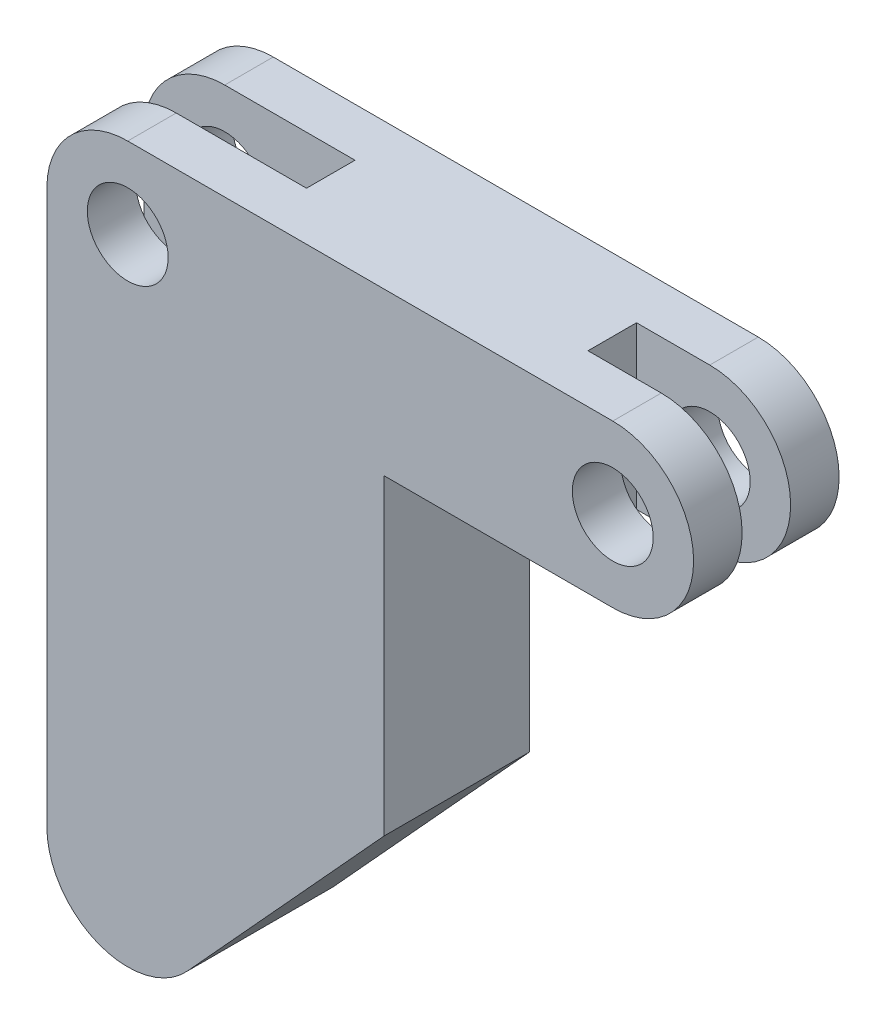
ISO-10303-21;
HEADER;
FILE_DESCRIPTION(('STEP AP214'),'2;1');
FILE_NAME('part.step','',(''),(''),'','','');
FILE_SCHEMA(('AUTOMOTIVE_DESIGN { 1 0 10303 214 1 1 1 1 }'));
ENDSEC;
DATA;
#1=APPLICATION_CONTEXT('core data for automotive mechanical design processes');
#2=APPLICATION_PROTOCOL_DEFINITION('international standard','automotive_design',2000,#1);
#3=PRODUCT_CONTEXT('',#1,'mechanical');
#4=PRODUCT('Part','Part','',(#3));
#5=PRODUCT_RELATED_PRODUCT_CATEGORY('part','',(#4));
#6=PRODUCT_DEFINITION_FORMATION('','',#4);
#7=PRODUCT_DEFINITION_CONTEXT('part definition',#1,'design');
#8=PRODUCT_DEFINITION('design','',#6,#7);
#9=PRODUCT_DEFINITION_SHAPE('','',#8);
#10=(LENGTH_UNIT() NAMED_UNIT(*) SI_UNIT(.MILLI.,.METRE.));
#11=(NAMED_UNIT(*) PLANE_ANGLE_UNIT() SI_UNIT($,.RADIAN.));
#12=(NAMED_UNIT(*) SI_UNIT($,.STERADIAN.) SOLID_ANGLE_UNIT());
#13=UNCERTAINTY_MEASURE_WITH_UNIT(LENGTH_MEASURE(1.E-05),#10,'distance_accuracy_value','');
#14=(GEOMETRIC_REPRESENTATION_CONTEXT(3) GLOBAL_UNCERTAINTY_ASSIGNED_CONTEXT((#13)) GLOBAL_UNIT_ASSIGNED_CONTEXT((#10,
#11,#12)) REPRESENTATION_CONTEXT('',''));
#15=CARTESIAN_POINT('',(0.,0.,0.));
#16=DIRECTION('',(0.,0.,1.));
#17=DIRECTION('',(1.,0.,0.));
#18=AXIS2_PLACEMENT_3D('',#15,#16,#17);
#19=CARTESIAN_POINT('',(15.,0.,4.5));
#20=DIRECTION('',(0.,0.,-1.));
#21=DIRECTION('',(-1.,0.,0.));
#22=AXIS2_PLACEMENT_3D('',#19,#20,#21);
#23=CYLINDRICAL_SURFACE('',#22,5.);
#24=CARTESIAN_POINT('',(15.,0.,1.5));
#25=DIRECTION('',(0.,0.,1.));
#26=DIRECTION('',(-1.,0.,0.));
#27=AXIS2_PLACEMENT_3D('',#24,#25,#26);
#28=CIRCLE('',#27,5.);
#29=CARTESIAN_POINT('',(15.0000000000001,-5.,1.5));
#30=VERTEX_POINT('',#29);
#31=CARTESIAN_POINT('',(15.,5.00000000000001,1.5));
#32=VERTEX_POINT('',#31);
#33=EDGE_CURVE('E178',#30,#32,#28,.T.);
#34=ORIENTED_EDGE('',*,*,#33,.T.);
#35=DIRECTION('',(0.,0.,-1.));
#36=VECTOR('',#35,1.);
#37=CARTESIAN_POINT('',(15.,5.00000000000001,4.5));
#38=LINE('',#37,#36);
#39=CARTESIAN_POINT('',(15.,5.00000000000001,4.5));
#40=VERTEX_POINT('',#39);
#41=EDGE_CURVE('E290',#40,#32,#38,.T.);
#42=ORIENTED_EDGE('',*,*,#41,.F.);
#43=CARTESIAN_POINT('',(15.,0.,4.5));
#44=DIRECTION('',(0.,0.,1.));
#45=DIRECTION('',(1.,0.,0.));
#46=AXIS2_PLACEMENT_3D('',#43,#44,#45);
#47=CIRCLE('',#46,5.);
#48=CARTESIAN_POINT('',(15.,-4.99999999999999,4.5));
#49=VERTEX_POINT('',#48);
#50=EDGE_CURVE('E226',#49,#40,#47,.T.);
#51=ORIENTED_EDGE('',*,*,#50,.F.);
#52=DIRECTION('',(0.,0.,-1.));
#53=VECTOR('',#52,1.);
#54=CARTESIAN_POINT('',(15.,-4.99999999999999,4.5));
#55=LINE('',#54,#53);
#56=EDGE_CURVE('E46',#49,#30,#55,.T.);
#57=ORIENTED_EDGE('',*,*,#56,.T.);
#58=EDGE_LOOP('',(#34,#42,#51,#57));
#59=FACE_BOUND('',#58,.T.);
#60=ADVANCED_FACE('F37',(#59),#23,.T.);
#61=CARTESIAN_POINT('',(15.,0.,4.5));
#62=DIRECTION('',(0.,0.,-1.));
#63=DIRECTION('',(-1.,0.,0.));
#64=AXIS2_PLACEMENT_3D('',#61,#62,#63);
#65=CYLINDRICAL_SURFACE('',#64,2.5);
#66=CARTESIAN_POINT('',(15.,0.,4.5));
#67=DIRECTION('',(0.,0.,1.));
#68=DIRECTION('',(1.,0.,0.));
#69=AXIS2_PLACEMENT_3D('',#66,#67,#68);
#70=CIRCLE('',#69,2.5);
#71=CARTESIAN_POINT('',(17.5,0.,4.5));
#72=VERTEX_POINT('',#71);
#73=EDGE_CURVE('E239',#72,#72,#70,.T.);
#74=ORIENTED_EDGE('',*,*,#73,.T.);
#75=EDGE_LOOP('',(#74));
#76=FACE_BOUND('',#75,.T.);
#77=CARTESIAN_POINT('',(15.,0.,1.5));
#78=DIRECTION('',(0.,0.,-1.));
#79=DIRECTION('',(-1.,0.,0.));
#80=AXIS2_PLACEMENT_3D('',#77,#78,#79);
#81=CIRCLE('',#80,2.5);
#82=CARTESIAN_POINT('',(12.5,0.,1.5));
#83=VERTEX_POINT('',#82);
#84=EDGE_CURVE('E183',#83,#83,#81,.T.);
#85=ORIENTED_EDGE('',*,*,#84,.T.);
#86=EDGE_LOOP('',(#85));
#87=FACE_BOUND('',#86,.T.);
#88=ADVANCED_FACE('F311',(#76,#87),#65,.F.);
#89=CARTESIAN_POINT('',(-15.,0.,4.5));
#90=DIRECTION('',(0.,0.,-1.));
#91=DIRECTION('',(-1.,0.,0.));
#92=AXIS2_PLACEMENT_3D('',#89,#90,#91);
#93=CYLINDRICAL_SURFACE('',#92,5.);
#94=CARTESIAN_POINT('',(-15.,0.,1.5));
#95=DIRECTION('',(0.,0.,1.));
#96=DIRECTION('',(-1.,0.,0.));
#97=AXIS2_PLACEMENT_3D('',#94,#95,#96);
#98=CIRCLE('',#97,5.00000000000005);
#99=CARTESIAN_POINT('',(-15.,5.,1.5));
#100=VERTEX_POINT('',#99);
#101=CARTESIAN_POINT('',(-20.,0.,1.5));
#102=VERTEX_POINT('',#101);
#103=EDGE_CURVE('E191',#100,#102,#98,.T.);
#104=ORIENTED_EDGE('',*,*,#103,.T.);
#105=DIRECTION('',(0.,0.,-1.));
#106=VECTOR('',#105,1.);
#107=CARTESIAN_POINT('',(-20.,0.,4.5));
#108=LINE('',#107,#106);
#109=CARTESIAN_POINT('',(-20.,0.,4.5));
#110=VERTEX_POINT('',#109);
#111=EDGE_CURVE('E282',#110,#102,#108,.T.);
#112=ORIENTED_EDGE('',*,*,#111,.F.);
#113=CARTESIAN_POINT('',(-15.,0.,4.5));
#114=DIRECTION('',(0.,0.,1.));
#115=DIRECTION('',(1.,0.,0.));
#116=AXIS2_PLACEMENT_3D('',#113,#114,#115);
#117=CIRCLE('',#116,5.);
#118=CARTESIAN_POINT('',(-15.,5.,4.5));
#119=VERTEX_POINT('',#118);
#120=EDGE_CURVE('E231',#119,#110,#117,.T.);
#121=ORIENTED_EDGE('',*,*,#120,.F.);
#122=DIRECTION('',(0.,0.,-1.));
#123=VECTOR('',#122,1.);
#124=CARTESIAN_POINT('',(-15.,5.,4.5));
#125=LINE('',#124,#123);
#126=EDGE_CURVE('E286',#119,#100,#125,.T.);
#127=ORIENTED_EDGE('',*,*,#126,.T.);
#128=EDGE_LOOP('',(#104,#112,#121,#127));
#129=FACE_BOUND('',#128,.T.);
#130=ADVANCED_FACE('F367',(#129),#93,.T.);
#131=CARTESIAN_POINT('',(0.,5.,4.5));
#132=DIRECTION('',(0.,1.,0.));
#133=DIRECTION('',(-1.,0.,0.));
#134=AXIS2_PLACEMENT_3D('',#131,#132,#133);
#135=PLANE('',#134);
#136=DIRECTION('',(-1.,0.,0.));
#137=VECTOR('',#136,1.);
#138=CARTESIAN_POINT('',(10.4686995280065,5.,-1.5));
#139=LINE('',#138,#137);
#140=CARTESIAN_POINT('',(15.,5.00000000000001,-1.5));
#141=VERTEX_POINT('',#140);
#142=CARTESIAN_POINT('',(10.4686995280065,5.,-1.5));
#143=VERTEX_POINT('',#142);
#144=EDGE_CURVE('E170',#141,#143,#139,.T.);
#145=ORIENTED_EDGE('',*,*,#144,.F.);
#146=CARTESIAN_POINT('',(15.,5.00000000000001,-4.5));
#147=VERTEX_POINT('',#146);
#148=EDGE_CURVE('E289',#141,#147,#38,.T.);
#149=ORIENTED_EDGE('',*,*,#148,.T.);
#150=DIRECTION('',(1.,0.,0.));
#151=VECTOR('',#150,1.);
#152=CARTESIAN_POINT('',(0.,5.,-4.5));
#153=LINE('',#152,#151);
#154=CARTESIAN_POINT('',(-15.,5.,-4.5));
#155=VERTEX_POINT('',#154);
#156=EDGE_CURVE('E256',#155,#147,#153,.T.);
#157=ORIENTED_EDGE('',*,*,#156,.F.);
#158=CARTESIAN_POINT('',(-15.,5.,-1.5));
#159=VERTEX_POINT('',#158);
#160=EDGE_CURVE('E285',#159,#155,#125,.T.);
#161=ORIENTED_EDGE('',*,*,#160,.F.);
#162=DIRECTION('',(1.,0.,0.));
#163=VECTOR('',#162,1.);
#164=CARTESIAN_POINT('',(0.,5.,-1.5));
#165=LINE('',#164,#163);
#166=CARTESIAN_POINT('',(-6.9423149924925,5.,-1.5));
#167=VERTEX_POINT('',#166);
#168=EDGE_CURVE('E193',#159,#167,#165,.T.);
#169=ORIENTED_EDGE('',*,*,#168,.T.);
#170=DIRECTION('',(0.,0.,1.));
#171=VECTOR('',#170,1.);
#172=CARTESIAN_POINT('',(-6.9423149924925,5.,-1.5));
#173=LINE('',#172,#171);
#174=CARTESIAN_POINT('',(-6.9423149924925,5.,1.5));
#175=VERTEX_POINT('',#174);
#176=EDGE_CURVE('E212',#167,#175,#173,.T.);
#177=ORIENTED_EDGE('',*,*,#176,.T.);
#178=DIRECTION('',(1.,0.,0.));
#179=VECTOR('',#178,1.);
#180=CARTESIAN_POINT('',(0.,5.,1.5));
#181=LINE('',#180,#179);
#182=EDGE_CURVE('E190',#100,#175,#181,.T.);
#183=ORIENTED_EDGE('',*,*,#182,.F.);
#184=ORIENTED_EDGE('',*,*,#126,.F.);
#185=DIRECTION('',(1.,0.,0.));
#186=VECTOR('',#185,1.);
#187=CARTESIAN_POINT('',(0.,5.,4.5));
#188=LINE('',#187,#186);
#189=EDGE_CURVE('E228',#119,#40,#188,.T.);
#190=ORIENTED_EDGE('',*,*,#189,.T.);
#191=ORIENTED_EDGE('',*,*,#41,.T.);
#192=DIRECTION('',(-1.,0.,0.));
#193=VECTOR('',#192,1.);
#194=CARTESIAN_POINT('',(10.4686995280065,5.,1.5));
#195=LINE('',#194,#193);
#196=CARTESIAN_POINT('',(10.4686995280065,5.,1.5));
#197=VERTEX_POINT('',#196);
#198=EDGE_CURVE('E54',#32,#197,#195,.T.);
#199=ORIENTED_EDGE('',*,*,#198,.T.);
#200=DIRECTION('',(0.,0.,1.));
#201=VECTOR('',#200,1.);
#202=CARTESIAN_POINT('',(10.4686995280065,5.,-1.5));
#203=LINE('',#202,#201);
#204=EDGE_CURVE('E164',#143,#197,#203,.T.);
#205=ORIENTED_EDGE('',*,*,#204,.F.);
#206=EDGE_LOOP('',(#145,#149,#157,#161,#169,#177,#183,#184,#190,#191,#199,#205));
#207=FACE_BOUND('',#206,.T.);
#208=ADVANCED_FACE('F180',(#207),#135,.T.);
#209=CARTESIAN_POINT('',(-20.,0.,4.5));
#210=DIRECTION('',(1.,0.,0.));
#211=DIRECTION('',(0.,0.,-1.));
#212=AXIS2_PLACEMENT_3D('',#209,#210,#211);
#213=PLANE('',#212);
#214=DIRECTION('',(0.,1.,0.));
#215=VECTOR('',#214,1.);
#216=CARTESIAN_POINT('',(-20.,0.,-1.5));
#217=LINE('',#216,#215);
#218=CARTESIAN_POINT('',(-20.,-8.26516535468284,-1.5));
#219=VERTEX_POINT('',#218);
#220=CARTESIAN_POINT('',(-20.,0.,-1.5));
#221=VERTEX_POINT('',#220);
#222=EDGE_CURVE('E196',#219,#221,#217,.T.);
#223=ORIENTED_EDGE('',*,*,#222,.T.);
#224=CARTESIAN_POINT('',(-20.,0.,-4.5));
#225=VERTEX_POINT('',#224);
#226=EDGE_CURVE('E281',#221,#225,#108,.T.);
#227=ORIENTED_EDGE('',*,*,#226,.T.);
#228=DIRECTION('',(0.,-1.,0.));
#229=VECTOR('',#228,1.);
#230=CARTESIAN_POINT('',(-20.,0.,-4.5));
#231=LINE('',#230,#229);
#232=CARTESIAN_POINT('',(-20.,-34.242134344058,-4.5));
#233=VERTEX_POINT('',#232);
#234=EDGE_CURVE('E262',#225,#233,#231,.T.);
#235=ORIENTED_EDGE('',*,*,#234,.T.);
#236=DIRECTION('',(0.,0.,-1.));
#237=VECTOR('',#236,1.);
#238=CARTESIAN_POINT('',(-20.,-34.242134344058,4.5));
#239=LINE('',#238,#237);
#240=CARTESIAN_POINT('',(-20.,-34.242134344058,4.5));
#241=VERTEX_POINT('',#240);
#242=EDGE_CURVE('E278',#241,#233,#239,.T.);
#243=ORIENTED_EDGE('',*,*,#242,.F.);
#244=DIRECTION('',(0.,-1.,0.));
#245=VECTOR('',#244,1.);
#246=CARTESIAN_POINT('',(-20.,0.,4.5));
#247=LINE('',#246,#245);
#248=EDGE_CURVE('E233',#110,#241,#247,.T.);
#249=ORIENTED_EDGE('',*,*,#248,.F.);
#250=ORIENTED_EDGE('',*,*,#111,.T.);
#251=DIRECTION('',(0.,1.,0.));
#252=VECTOR('',#251,1.);
#253=CARTESIAN_POINT('',(-20.,0.,1.5));
#254=LINE('',#253,#252);
#255=CARTESIAN_POINT('',(-20.,-8.26516535468284,1.5));
#256=VERTEX_POINT('',#255);
#257=EDGE_CURVE('E206',#256,#102,#254,.T.);
#258=ORIENTED_EDGE('',*,*,#257,.F.);
#259=DIRECTION('',(0.,0.,1.));
#260=VECTOR('',#259,1.);
#261=CARTESIAN_POINT('',(-20.,-8.26516535468284,-1.5));
#262=LINE('',#261,#260);
#263=EDGE_CURVE('E62',#219,#256,#262,.T.);
#264=ORIENTED_EDGE('',*,*,#263,.F.);
#265=EDGE_LOOP('',(#223,#227,#235,#243,#249,#250,#258,#264));
#266=FACE_BOUND('',#265,.T.);
#267=ADVANCED_FACE('F326',(#266),#213,.F.);
#268=CARTESIAN_POINT('',(-15.,0.,4.5));
#269=DIRECTION('',(0.,0.,-1.));
#270=DIRECTION('',(-1.,0.,0.));
#271=AXIS2_PLACEMENT_3D('',#268,#269,#270);
#272=CYLINDRICAL_SURFACE('',#271,2.5);
#273=CARTESIAN_POINT('',(-15.,0.,-4.5));
#274=DIRECTION('',(0.,0.,1.));
#275=DIRECTION('',(1.,0.,0.));
#276=AXIS2_PLACEMENT_3D('',#273,#274,#275);
#277=CIRCLE('',#276,2.5);
#278=CARTESIAN_POINT('',(-12.5,0.,-4.5));
#279=VERTEX_POINT('',#278);
#280=EDGE_CURVE('E224',#279,#279,#277,.T.);
#281=ORIENTED_EDGE('',*,*,#280,.F.);
#282=EDGE_LOOP('',(#281));
#283=FACE_BOUND('',#282,.T.);
#284=CARTESIAN_POINT('',(-15.,0.,-1.5));
#285=DIRECTION('',(0.,0.,1.));
#286=DIRECTION('',(1.,0.,0.));
#287=AXIS2_PLACEMENT_3D('',#284,#285,#286);
#288=CIRCLE('',#287,2.5);
#289=CARTESIAN_POINT('',(-12.5,0.,-1.5));
#290=VERTEX_POINT('',#289);
#291=EDGE_CURVE('E250',#290,#290,#288,.T.);
#292=ORIENTED_EDGE('',*,*,#291,.T.);
#293=EDGE_LOOP('',(#292));
#294=FACE_BOUND('',#293,.T.);
#295=ADVANCED_FACE('F323',(#283,#294),#272,.F.);
#296=CARTESIAN_POINT('',(0.854324149664104,0.,4.5));
#297=DIRECTION('',(-1.,0.,0.));
#298=DIRECTION('',(0.,0.,1.));
#299=AXIS2_PLACEMENT_3D('',#296,#297,#298);
#300=PLANE('',#299);
#301=DIRECTION('',(0.,1.,0.));
#302=VECTOR('',#301,1.);
#303=CARTESIAN_POINT('',(0.854324149664104,0.,-4.5));
#304=LINE('',#303,#302);
#305=CARTESIAN_POINT('',(0.854324149664101,-24.2980374406502,-4.5));
#306=VERTEX_POINT('',#305);
#307=CARTESIAN_POINT('',(0.854324149664104,-5.,-4.5));
#308=VERTEX_POINT('',#307);
#309=EDGE_CURVE('E246',#306,#308,#304,.T.);
#310=ORIENTED_EDGE('',*,*,#309,.T.);
#311=DIRECTION('',(0.,0.,-1.));
#312=VECTOR('',#311,1.);
#313=CARTESIAN_POINT('',(0.854324149664104,-5.,4.5));
#314=LINE('',#313,#312);
#315=CARTESIAN_POINT('',(0.854324149664104,-5.,4.5));
#316=VERTEX_POINT('',#315);
#317=EDGE_CURVE('E11',#316,#308,#314,.T.);
#318=ORIENTED_EDGE('',*,*,#317,.F.);
#319=DIRECTION('',(0.,1.,0.));
#320=VECTOR('',#319,1.);
#321=CARTESIAN_POINT('',(0.854324149664104,0.,4.5));
#322=LINE('',#321,#320);
#323=CARTESIAN_POINT('',(0.854324149664101,-24.2980374406502,4.5));
#324=VERTEX_POINT('',#323);
#325=EDGE_CURVE('E220',#324,#316,#322,.T.);
#326=ORIENTED_EDGE('',*,*,#325,.F.);
#327=DIRECTION('',(0.,0.,-1.));
#328=VECTOR('',#327,1.);
#329=CARTESIAN_POINT('',(0.854324149664101,-24.2980374406502,4.5));
#330=LINE('',#329,#328);
#331=EDGE_CURVE('E245',#324,#306,#330,.T.);
#332=ORIENTED_EDGE('',*,*,#331,.T.);
#333=EDGE_LOOP('',(#310,#318,#326,#332));
#334=FACE_BOUND('',#333,.T.);
#335=ADVANCED_FACE('F39',(#334),#300,.F.);
#336=CARTESIAN_POINT('',(0.,-5.,4.5));
#337=DIRECTION('',(0.,1.,0.));
#338=DIRECTION('',(-1.,0.,0.));
#339=AXIS2_PLACEMENT_3D('',#336,#337,#338);
#340=PLANE('',#339);
#341=CARTESIAN_POINT('',(15.0000000000001,-5.,-1.5));
#342=VERTEX_POINT('',#341);
#343=CARTESIAN_POINT('',(15.,-4.99999999999999,-4.5));
#344=VERTEX_POINT('',#343);
#345=EDGE_CURVE('E292',#342,#344,#55,.T.);
#346=ORIENTED_EDGE('',*,*,#345,.F.);
#347=DIRECTION('',(1.,0.,0.));
#348=VECTOR('',#347,1.);
#349=CARTESIAN_POINT('',(10.4686995280065,-5.,-1.5));
#350=LINE('',#349,#348);
#351=CARTESIAN_POINT('',(10.4686995280065,-5.,-1.5));
#352=VERTEX_POINT('',#351);
#353=EDGE_CURVE('E169',#352,#342,#350,.T.);
#354=ORIENTED_EDGE('',*,*,#353,.F.);
#355=DIRECTION('',(0.,0.,1.));
#356=VECTOR('',#355,1.);
#357=CARTESIAN_POINT('',(10.4686995280065,-5.,-1.5));
#358=LINE('',#357,#356);
#359=CARTESIAN_POINT('',(10.4686995280065,-5.,1.5));
#360=VERTEX_POINT('',#359);
#361=EDGE_CURVE('E166',#352,#360,#358,.T.);
#362=ORIENTED_EDGE('',*,*,#361,.T.);
#363=DIRECTION('',(1.,0.,0.));
#364=VECTOR('',#363,1.);
#365=CARTESIAN_POINT('',(10.4686995280065,-5.,1.5));
#366=LINE('',#365,#364);
#367=EDGE_CURVE('E377',#360,#30,#366,.T.);
#368=ORIENTED_EDGE('',*,*,#367,.T.);
#369=ORIENTED_EDGE('',*,*,#56,.F.);
#370=DIRECTION('',(1.,0.,0.));
#371=VECTOR('',#370,1.);
#372=CARTESIAN_POINT('',(0.,-5.,4.5));
#373=LINE('',#372,#371);
#374=EDGE_CURVE('E223',#316,#49,#373,.T.);
#375=ORIENTED_EDGE('',*,*,#374,.F.);
#376=ORIENTED_EDGE('',*,*,#317,.T.);
#377=DIRECTION('',(1.,0.,0.));
#378=VECTOR('',#377,1.);
#379=CARTESIAN_POINT('',(0.,-5.,-4.5));
#380=LINE('',#379,#378);
#381=EDGE_CURVE('E249',#308,#344,#380,.T.);
#382=ORIENTED_EDGE('',*,*,#381,.T.);
#383=EDGE_LOOP('',(#346,#354,#362,#368,#369,#375,#376,#382));
#384=FACE_BOUND('',#383,.T.);
#385=ADVANCED_FACE('F387',(#384),#340,.F.);
#386=ORIENTED_EDGE('',*,*,#148,.F.);
#387=CARTESIAN_POINT('',(15.,0.,-1.5));
#388=DIRECTION('',(0.,0.,1.));
#389=DIRECTION('',(-1.,0.,0.));
#390=AXIS2_PLACEMENT_3D('',#387,#388,#389);
#391=CIRCLE('',#390,5.);
#392=EDGE_CURVE('E175',#342,#141,#391,.T.);
#393=ORIENTED_EDGE('',*,*,#392,.F.);
#394=ORIENTED_EDGE('',*,*,#345,.T.);
#395=CARTESIAN_POINT('',(15.,0.,-4.5));
#396=DIRECTION('',(0.,0.,1.));
#397=DIRECTION('',(1.,0.,0.));
#398=AXIS2_PLACEMENT_3D('',#395,#396,#397);
#399=CIRCLE('',#398,5.);
#400=EDGE_CURVE('E253',#344,#147,#399,.T.);
#401=ORIENTED_EDGE('',*,*,#400,.T.);
#402=EDGE_LOOP('',(#386,#393,#394,#401));
#403=FACE_BOUND('',#402,.T.);
#404=ADVANCED_FACE('F386',(#403),#23,.T.);
#405=ORIENTED_EDGE('',*,*,#226,.F.);
#406=CARTESIAN_POINT('',(-15.,0.,-1.5));
#407=DIRECTION('',(0.,0.,1.));
#408=DIRECTION('',(-1.,0.,0.));
#409=AXIS2_PLACEMENT_3D('',#406,#407,#408);
#410=CIRCLE('',#409,5.00000000000005);
#411=EDGE_CURVE('E188',#159,#221,#410,.T.);
#412=ORIENTED_EDGE('',*,*,#411,.F.);
#413=ORIENTED_EDGE('',*,*,#160,.T.);
#414=CARTESIAN_POINT('',(-15.,0.,-4.5));
#415=DIRECTION('',(0.,0.,1.));
#416=DIRECTION('',(1.,0.,0.));
#417=AXIS2_PLACEMENT_3D('',#414,#415,#416);
#418=CIRCLE('',#417,5.);
#419=EDGE_CURVE('E259',#155,#225,#418,.T.);
#420=ORIENTED_EDGE('',*,*,#419,.T.);
#421=EDGE_LOOP('',(#405,#412,#413,#420));
#422=FACE_BOUND('',#421,.T.);
#423=ADVANCED_FACE('F346',(#422),#93,.T.);
#424=CARTESIAN_POINT('',(-15.,-34.2421343440581,4.5));
#425=DIRECTION('',(0.,0.,-1.));
#426=DIRECTION('',(-1.,0.,0.));
#427=AXIS2_PLACEMENT_3D('',#424,#425,#426);
#428=CYLINDRICAL_SURFACE('',#427,5.);
#429=CARTESIAN_POINT('',(-15.,-34.2421343440581,-4.5));
#430=DIRECTION('',(0.,0.,1.));
#431=DIRECTION('',(1.,0.,0.));
#432=AXIS2_PLACEMENT_3D('',#429,#430,#431);
#433=CIRCLE('',#432,5.);
#434=CARTESIAN_POINT('',(-11.3081686566006,-37.6141339484314,-4.5));
#435=VERTEX_POINT('',#434);
#436=EDGE_CURVE('E264',#233,#435,#433,.T.);
#437=ORIENTED_EDGE('',*,*,#436,.T.);
#438=DIRECTION('',(0.,0.,-1.));
#439=VECTOR('',#438,1.);
#440=CARTESIAN_POINT('',(-11.3081686566006,-37.6141339484314,4.5));
#441=LINE('',#440,#439);
#442=CARTESIAN_POINT('',(-11.3081686566006,-37.6141339484314,4.5));
#443=VERTEX_POINT('',#442);
#444=EDGE_CURVE('E275',#443,#435,#441,.T.);
#445=ORIENTED_EDGE('',*,*,#444,.F.);
#446=CARTESIAN_POINT('',(-15.,-34.2421343440581,4.5));
#447=DIRECTION('',(0.,0.,1.));
#448=DIRECTION('',(1.,0.,0.));
#449=AXIS2_PLACEMENT_3D('',#446,#447,#448);
#450=CIRCLE('',#449,5.);
#451=EDGE_CURVE('E235',#241,#443,#450,.T.);
#452=ORIENTED_EDGE('',*,*,#451,.F.);
#453=ORIENTED_EDGE('',*,*,#242,.T.);
#454=EDGE_LOOP('',(#437,#445,#452,#453));
#455=FACE_BOUND('',#454,.T.);
#456=ADVANCED_FACE('F309',(#455),#428,.T.);
#457=CARTESIAN_POINT('',(15.,0.,-1.5));
#458=DIRECTION('',(0.,0.,-1.));
#459=DIRECTION('',(-1.,0.,0.));
#460=AXIS2_PLACEMENT_3D('',#457,#458,#459);
#461=CIRCLE('',#460,2.5);
#462=CARTESIAN_POINT('',(12.5,0.,-1.5));
#463=VERTEX_POINT('',#462);
#464=EDGE_CURVE('E41',#463,#463,#461,.T.);
#465=ORIENTED_EDGE('',*,*,#464,.F.);
#466=EDGE_LOOP('',(#465));
#467=FACE_BOUND('',#466,.T.);
#468=CARTESIAN_POINT('',(15.,0.,-4.5));
#469=DIRECTION('',(0.,0.,1.));
#470=DIRECTION('',(1.,0.,0.));
#471=AXIS2_PLACEMENT_3D('',#468,#469,#470);
#472=CIRCLE('',#471,2.5);
#473=CARTESIAN_POINT('',(17.5,0.,-4.5));
#474=VERTEX_POINT('',#473);
#475=EDGE_CURVE('E268',#474,#474,#472,.T.);
#476=ORIENTED_EDGE('',*,*,#475,.F.);
#477=EDGE_LOOP('',(#476));
#478=FACE_BOUND('',#477,.T.);
#479=ADVANCED_FACE('F305',(#467,#478),#65,.F.);
#480=CARTESIAN_POINT('',(12.5650731527098,-11.476532311156,4.5));
#481=DIRECTION('',(-0.738366268679859,0.674399920874685,0.));
#482=DIRECTION('',(-0.674399920874685,-0.73836626867986,0.));
#483=AXIS2_PLACEMENT_3D('',#480,#481,#482);
#484=PLANE('',#483);
#485=DIRECTION('',(0.674399920874685,0.73836626867986,0.));
#486=VECTOR('',#485,1.);
#487=CARTESIAN_POINT('',(12.5650731527098,-11.476532311156,-4.5));
#488=LINE('',#487,#486);
#489=EDGE_CURVE('E266',#435,#306,#488,.T.);
#490=ORIENTED_EDGE('',*,*,#489,.T.);
#491=ORIENTED_EDGE('',*,*,#331,.F.);
#492=DIRECTION('',(0.674399920874685,0.73836626867986,0.));
#493=VECTOR('',#492,1.);
#494=CARTESIAN_POINT('',(12.5650731527098,-11.476532311156,4.5));
#495=LINE('',#494,#493);
#496=EDGE_CURVE('E237',#443,#324,#495,.T.);
#497=ORIENTED_EDGE('',*,*,#496,.F.);
#498=ORIENTED_EDGE('',*,*,#444,.T.);
#499=EDGE_LOOP('',(#490,#491,#497,#498));
#500=FACE_BOUND('',#499,.T.);
#501=ADVANCED_FACE('F308',(#500),#484,.F.);
#502=CARTESIAN_POINT('',(-15.,0.,1.5));
#503=DIRECTION('',(0.,0.,1.));
#504=DIRECTION('',(1.,0.,0.));
#505=AXIS2_PLACEMENT_3D('',#502,#503,#504);
#506=CIRCLE('',#505,2.5);
#507=CARTESIAN_POINT('',(-12.5,0.,1.5));
#508=VERTEX_POINT('',#507);
#509=EDGE_CURVE('E215',#508,#508,#506,.T.);
#510=ORIENTED_EDGE('',*,*,#509,.F.);
#511=EDGE_LOOP('',(#510));
#512=FACE_BOUND('',#511,.T.);
#513=CARTESIAN_POINT('',(-15.,0.,4.5));
#514=DIRECTION('',(0.,0.,1.));
#515=DIRECTION('',(1.,0.,0.));
#516=AXIS2_PLACEMENT_3D('',#513,#514,#515);
#517=CIRCLE('',#516,2.5);
#518=CARTESIAN_POINT('',(-12.5,0.,4.5));
#519=VERTEX_POINT('',#518);
#520=EDGE_CURVE('E242',#519,#519,#517,.T.);
#521=ORIENTED_EDGE('',*,*,#520,.T.);
#522=EDGE_LOOP('',(#521));
#523=FACE_BOUND('',#522,.T.);
#524=ADVANCED_FACE('F328',(#512,#523),#272,.F.);
#525=CARTESIAN_POINT('',(0.,0.,4.5));
#526=DIRECTION('',(0.,0.,1.));
#527=DIRECTION('',(1.,0.,0.));
#528=AXIS2_PLACEMENT_3D('',#525,#526,#527);
#529=PLANE('',#528);
#530=ORIENTED_EDGE('',*,*,#325,.T.);
#531=ORIENTED_EDGE('',*,*,#374,.T.);
#532=ORIENTED_EDGE('',*,*,#50,.T.);
#533=ORIENTED_EDGE('',*,*,#189,.F.);
#534=ORIENTED_EDGE('',*,*,#120,.T.);
#535=ORIENTED_EDGE('',*,*,#248,.T.);
#536=ORIENTED_EDGE('',*,*,#451,.T.);
#537=ORIENTED_EDGE('',*,*,#496,.T.);
#538=EDGE_LOOP('',(#530,#531,#532,#533,#534,#535,#536,#537));
#539=FACE_BOUND('',#538,.T.);
#540=ORIENTED_EDGE('',*,*,#73,.F.);
#541=EDGE_LOOP('',(#540));
#542=FACE_BOUND('',#541,.T.);
#543=ORIENTED_EDGE('',*,*,#520,.F.);
#544=EDGE_LOOP('',(#543));
#545=FACE_BOUND('',#544,.T.);
#546=ADVANCED_FACE('F318',(#539,#542,#545),#529,.T.);
#547=CARTESIAN_POINT('',(0.,0.,-4.5));
#548=DIRECTION('',(0.,0.,1.));
#549=DIRECTION('',(1.,0.,0.));
#550=AXIS2_PLACEMENT_3D('',#547,#548,#549);
#551=PLANE('',#550);
#552=ORIENTED_EDGE('',*,*,#309,.F.);
#553=ORIENTED_EDGE('',*,*,#489,.F.);
#554=ORIENTED_EDGE('',*,*,#436,.F.);
#555=ORIENTED_EDGE('',*,*,#234,.F.);
#556=ORIENTED_EDGE('',*,*,#419,.F.);
#557=ORIENTED_EDGE('',*,*,#156,.T.);
#558=ORIENTED_EDGE('',*,*,#400,.F.);
#559=ORIENTED_EDGE('',*,*,#381,.F.);
#560=EDGE_LOOP('',(#552,#553,#554,#555,#556,#557,#558,#559));
#561=FACE_BOUND('',#560,.T.);
#562=ORIENTED_EDGE('',*,*,#475,.T.);
#563=EDGE_LOOP('',(#562));
#564=FACE_BOUND('',#563,.T.);
#565=ORIENTED_EDGE('',*,*,#280,.T.);
#566=EDGE_LOOP('',(#565));
#567=FACE_BOUND('',#566,.T.);
#568=ADVANCED_FACE('F314',(#561,#564,#567),#551,.F.);
#569=CARTESIAN_POINT('',(-6.9423149924925,0.,-1.5));
#570=DIRECTION('',(-1.,0.,0.));
#571=DIRECTION('',(0.,0.,1.));
#572=AXIS2_PLACEMENT_3D('',#569,#570,#571);
#573=PLANE('',#572);
#574=DIRECTION('',(0.,-1.,0.));
#575=VECTOR('',#574,1.);
#576=CARTESIAN_POINT('',(-6.9423149924925,0.,1.5));
#577=LINE('',#576,#575);
#578=CARTESIAN_POINT('',(-6.9423149924925,-8.26516535468284,1.5));
#579=VERTEX_POINT('',#578);
#580=EDGE_CURVE('E197',#175,#579,#577,.T.);
#581=ORIENTED_EDGE('',*,*,#580,.F.);
#582=ORIENTED_EDGE('',*,*,#176,.F.);
#583=DIRECTION('',(0.,-1.,0.));
#584=VECTOR('',#583,1.);
#585=CARTESIAN_POINT('',(-6.9423149924925,0.,-1.5));
#586=LINE('',#585,#584);
#587=CARTESIAN_POINT('',(-6.9423149924925,-8.26516535468284,-1.5));
#588=VERTEX_POINT('',#587);
#589=EDGE_CURVE('E202',#167,#588,#586,.T.);
#590=ORIENTED_EDGE('',*,*,#589,.T.);
#591=DIRECTION('',(0.,0.,1.));
#592=VECTOR('',#591,1.);
#593=CARTESIAN_POINT('',(-6.9423149924925,-8.26516535468284,-1.5));
#594=LINE('',#593,#592);
#595=EDGE_CURVE('E216',#588,#579,#594,.T.);
#596=ORIENTED_EDGE('',*,*,#595,.T.);
#597=EDGE_LOOP('',(#581,#582,#590,#596));
#598=FACE_BOUND('',#597,.T.);
#599=ADVANCED_FACE('F317',(#598),#573,.T.);
#600=CARTESIAN_POINT('',(0.,-8.26516535468284,-1.5));
#601=DIRECTION('',(0.,1.,0.));
#602=DIRECTION('',(0.,0.,1.));
#603=AXIS2_PLACEMENT_3D('',#600,#601,#602);
#604=PLANE('',#603);
#605=DIRECTION('',(-1.,0.,0.));
#606=VECTOR('',#605,1.);
#607=CARTESIAN_POINT('',(0.,-8.26516535468284,1.5));
#608=LINE('',#607,#606);
#609=EDGE_CURVE('E209',#579,#256,#608,.T.);
#610=ORIENTED_EDGE('',*,*,#609,.F.);
#611=ORIENTED_EDGE('',*,*,#595,.F.);
#612=DIRECTION('',(-1.,0.,0.));
#613=VECTOR('',#612,1.);
#614=CARTESIAN_POINT('',(0.,-8.26516535468284,-1.5));
#615=LINE('',#614,#613);
#616=EDGE_CURVE('E200',#588,#219,#615,.T.);
#617=ORIENTED_EDGE('',*,*,#616,.T.);
#618=ORIENTED_EDGE('',*,*,#263,.T.);
#619=EDGE_LOOP('',(#610,#611,#617,#618));
#620=FACE_BOUND('',#619,.T.);
#621=ADVANCED_FACE('F335',(#620),#604,.T.);
#622=CARTESIAN_POINT('',(0.,0.,-1.5));
#623=DIRECTION('',(0.,0.,1.));
#624=DIRECTION('',(1.,0.,0.));
#625=AXIS2_PLACEMENT_3D('',#622,#623,#624);
#626=PLANE('',#625);
#627=ORIENTED_EDGE('',*,*,#291,.F.);
#628=EDGE_LOOP('',(#627));
#629=FACE_BOUND('',#628,.T.);
#630=ORIENTED_EDGE('',*,*,#168,.F.);
#631=ORIENTED_EDGE('',*,*,#411,.T.);
#632=ORIENTED_EDGE('',*,*,#222,.F.);
#633=ORIENTED_EDGE('',*,*,#616,.F.);
#634=ORIENTED_EDGE('',*,*,#589,.F.);
#635=EDGE_LOOP('',(#630,#631,#632,#633,#634));
#636=FACE_BOUND('',#635,.T.);
#637=ADVANCED_FACE('F331',(#629,#636),#626,.T.);
#638=CARTESIAN_POINT('',(0.,0.,1.5));
#639=DIRECTION('',(0.,0.,1.));
#640=DIRECTION('',(1.,0.,0.));
#641=AXIS2_PLACEMENT_3D('',#638,#639,#640);
#642=PLANE('',#641);
#643=ORIENTED_EDGE('',*,*,#509,.T.);
#644=EDGE_LOOP('',(#643));
#645=FACE_BOUND('',#644,.T.);
#646=ORIENTED_EDGE('',*,*,#182,.T.);
#647=ORIENTED_EDGE('',*,*,#580,.T.);
#648=ORIENTED_EDGE('',*,*,#609,.T.);
#649=ORIENTED_EDGE('',*,*,#257,.T.);
#650=ORIENTED_EDGE('',*,*,#103,.F.);
#651=EDGE_LOOP('',(#646,#647,#648,#649,#650));
#652=FACE_BOUND('',#651,.T.);
#653=ADVANCED_FACE('F334',(#645,#652),#642,.F.);
#654=CARTESIAN_POINT('',(10.4686995280065,5.,-1.5));
#655=DIRECTION('',(-1.,0.,0.));
#656=DIRECTION('',(0.,0.,1.));
#657=AXIS2_PLACEMENT_3D('',#654,#655,#656);
#658=PLANE('',#657);
#659=DIRECTION('',(0.,-1.,0.));
#660=VECTOR('',#659,1.);
#661=CARTESIAN_POINT('',(10.4686995280065,5.,1.5));
#662=LINE('',#661,#660);
#663=EDGE_CURVE('E378',#197,#360,#662,.T.);
#664=ORIENTED_EDGE('',*,*,#663,.T.);
#665=ORIENTED_EDGE('',*,*,#361,.F.);
#666=DIRECTION('',(0.,-1.,0.));
#667=VECTOR('',#666,1.);
#668=CARTESIAN_POINT('',(10.4686995280065,5.,-1.5));
#669=LINE('',#668,#667);
#670=EDGE_CURVE('E159',#143,#352,#669,.T.);
#671=ORIENTED_EDGE('',*,*,#670,.F.);
#672=ORIENTED_EDGE('',*,*,#204,.T.);
#673=EDGE_LOOP('',(#664,#665,#671,#672));
#674=FACE_BOUND('',#673,.T.);
#675=ADVANCED_FACE('F162',(#674),#658,.F.);
#676=CARTESIAN_POINT('',(15.,0.,-1.5));
#677=DIRECTION('',(0.,0.,-1.));
#678=DIRECTION('',(-1.,0.,0.));
#679=AXIS2_PLACEMENT_3D('',#676,#677,#678);
#680=PLANE('',#679);
#681=ORIENTED_EDGE('',*,*,#464,.T.);
#682=EDGE_LOOP('',(#681));
#683=FACE_BOUND('',#682,.T.);
#684=ORIENTED_EDGE('',*,*,#144,.T.);
#685=ORIENTED_EDGE('',*,*,#670,.T.);
#686=ORIENTED_EDGE('',*,*,#353,.T.);
#687=ORIENTED_EDGE('',*,*,#392,.T.);
#688=EDGE_LOOP('',(#684,#685,#686,#687));
#689=FACE_BOUND('',#688,.T.);
#690=ADVANCED_FACE('F173',(#683,#689),#680,.F.);
#691=CARTESIAN_POINT('',(15.,0.,1.5));
#692=DIRECTION('',(0.,0.,-1.));
#693=DIRECTION('',(-1.,0.,0.));
#694=AXIS2_PLACEMENT_3D('',#691,#692,#693);
#695=PLANE('',#694);
#696=ORIENTED_EDGE('',*,*,#84,.F.);
#697=EDGE_LOOP('',(#696));
#698=FACE_BOUND('',#697,.T.);
#699=ORIENTED_EDGE('',*,*,#198,.F.);
#700=ORIENTED_EDGE('',*,*,#33,.F.);
#701=ORIENTED_EDGE('',*,*,#367,.F.);
#702=ORIENTED_EDGE('',*,*,#663,.F.);
#703=EDGE_LOOP('',(#699,#700,#701,#702));
#704=FACE_BOUND('',#703,.T.);
#705=ADVANCED_FACE('F503',(#698,#704),#695,.T.);
#706=CLOSED_SHELL('',(#60,#88,#130,#208,#267,#295,#335,#385,#404,#423,#456,#479,#501,#524,#546,
#568,#599,#621,#637,#653,#675,#690,#705));
#707=MANIFOLD_SOLID_BREP('B2',#706);
#708=ADVANCED_BREP_SHAPE_REPRESENTATION('',(#18,#707),#14);
#709=SHAPE_DEFINITION_REPRESENTATION(#9,#708);
ENDSEC;
END-ISO-10303-21;
